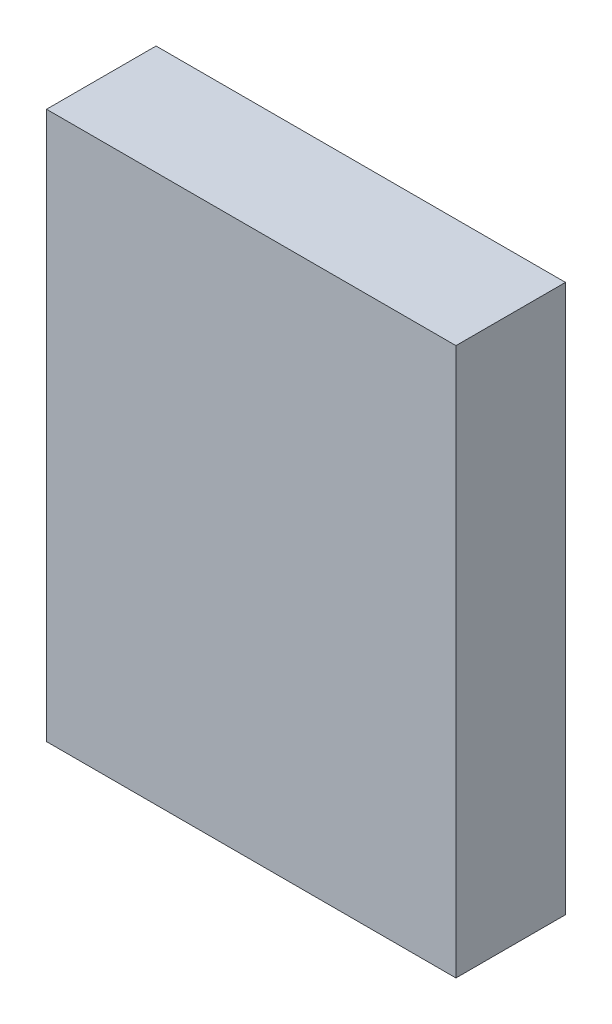
ISO-10303-21;
HEADER;
FILE_DESCRIPTION(('STEP AP214'),'2;1');
FILE_NAME('part.step','',(''),(''),'','','');
FILE_SCHEMA(('AUTOMOTIVE_DESIGN { 1 0 10303 214 1 1 1 1 }'));
ENDSEC;
DATA;
#1=APPLICATION_CONTEXT('core data for automotive mechanical design processes');
#2=APPLICATION_PROTOCOL_DEFINITION('international standard','automotive_design',2000,#1);
#3=PRODUCT_CONTEXT('',#1,'mechanical');
#4=PRODUCT('Part','Part','',(#3));
#5=PRODUCT_RELATED_PRODUCT_CATEGORY('part','',(#4));
#6=PRODUCT_DEFINITION_FORMATION('','',#4);
#7=PRODUCT_DEFINITION_CONTEXT('part definition',#1,'design');
#8=PRODUCT_DEFINITION('design','',#6,#7);
#9=PRODUCT_DEFINITION_SHAPE('','',#8);
#10=(LENGTH_UNIT() NAMED_UNIT(*) SI_UNIT(.MILLI.,.METRE.));
#11=(NAMED_UNIT(*) PLANE_ANGLE_UNIT() SI_UNIT($,.RADIAN.));
#12=(NAMED_UNIT(*) SI_UNIT($,.STERADIAN.) SOLID_ANGLE_UNIT());
#13=UNCERTAINTY_MEASURE_WITH_UNIT(LENGTH_MEASURE(1.E-05),#10,'distance_accuracy_value','');
#14=(GEOMETRIC_REPRESENTATION_CONTEXT(3) GLOBAL_UNCERTAINTY_ASSIGNED_CONTEXT((#13)) GLOBAL_UNIT_ASSIGNED_CONTEXT((#10,
#11,#12)) REPRESENTATION_CONTEXT('',''));
#15=CARTESIAN_POINT('',(0.,0.,0.));
#16=DIRECTION('',(0.,0.,1.));
#17=DIRECTION('',(1.,0.,0.));
#18=AXIS2_PLACEMENT_3D('',#15,#16,#17);
#19=CARTESIAN_POINT('',(-18.688963471708,-25.,10.));
#20=DIRECTION('',(0.,1.,0.));
#21=DIRECTION('',(0.,0.,1.));
#22=AXIS2_PLACEMENT_3D('',#19,#20,#21);
#23=PLANE('',#22);
#24=DIRECTION('',(1.,0.,0.));
#25=VECTOR('',#24,1.);
#26=CARTESIAN_POINT('',(-18.688963471708,-25.,0.));
#27=LINE('',#26,#25);
#28=CARTESIAN_POINT('',(-18.688963471708,-25.,0.));
#29=VERTEX_POINT('',#28);
#30=CARTESIAN_POINT('',(18.688963471708,-25.,0.));
#31=VERTEX_POINT('',#30);
#32=EDGE_CURVE('E111',#29,#31,#27,.T.);
#33=ORIENTED_EDGE('',*,*,#32,.T.);
#34=DIRECTION('',(0.,0.,-1.));
#35=VECTOR('',#34,1.);
#36=CARTESIAN_POINT('',(18.688963471708,-25.,10.));
#37=LINE('',#36,#35);
#38=CARTESIAN_POINT('',(18.688963471708,-25.,10.));
#39=VERTEX_POINT('',#38);
#40=EDGE_CURVE('E11',#39,#31,#37,.T.);
#41=ORIENTED_EDGE('',*,*,#40,.F.);
#42=DIRECTION('',(1.,0.,0.));
#43=VECTOR('',#42,1.);
#44=CARTESIAN_POINT('',(-18.688963471708,-25.,10.));
#45=LINE('',#44,#43);
#46=CARTESIAN_POINT('',(-18.688963471708,-25.,10.));
#47=VERTEX_POINT('',#46);
#48=EDGE_CURVE('E96',#47,#39,#45,.T.);
#49=ORIENTED_EDGE('',*,*,#48,.F.);
#50=DIRECTION('',(0.,0.,-1.));
#51=VECTOR('',#50,1.);
#52=CARTESIAN_POINT('',(-18.688963471708,-25.,10.));
#53=LINE('',#52,#51);
#54=EDGE_CURVE('E63',#47,#29,#53,.T.);
#55=ORIENTED_EDGE('',*,*,#54,.T.);
#56=EDGE_LOOP('',(#33,#41,#49,#55));
#57=FACE_BOUND('',#56,.T.);
#58=ADVANCED_FACE('F47',(#57),#23,.F.);
#59=CARTESIAN_POINT('',(18.688963471708,-25.,10.));
#60=DIRECTION('',(-1.,0.,0.));
#61=DIRECTION('',(0.,0.,1.));
#62=AXIS2_PLACEMENT_3D('',#59,#60,#61);
#63=PLANE('',#62);
#64=DIRECTION('',(0.,1.,0.));
#65=VECTOR('',#64,1.);
#66=CARTESIAN_POINT('',(18.688963471708,-25.,0.));
#67=LINE('',#66,#65);
#68=CARTESIAN_POINT('',(18.688963471708,25.,0.));
#69=VERTEX_POINT('',#68);
#70=EDGE_CURVE('E102',#31,#69,#67,.T.);
#71=ORIENTED_EDGE('',*,*,#70,.T.);
#72=DIRECTION('',(0.,0.,-1.));
#73=VECTOR('',#72,1.);
#74=CARTESIAN_POINT('',(18.688963471708,25.,10.));
#75=LINE('',#74,#73);
#76=CARTESIAN_POINT('',(18.688963471708,25.,10.));
#77=VERTEX_POINT('',#76);
#78=EDGE_CURVE('E55',#77,#69,#75,.T.);
#79=ORIENTED_EDGE('',*,*,#78,.F.);
#80=DIRECTION('',(0.,1.,0.));
#81=VECTOR('',#80,1.);
#82=CARTESIAN_POINT('',(18.688963471708,-25.,10.));
#83=LINE('',#82,#81);
#84=EDGE_CURVE('E88',#39,#77,#83,.T.);
#85=ORIENTED_EDGE('',*,*,#84,.F.);
#86=ORIENTED_EDGE('',*,*,#40,.T.);
#87=EDGE_LOOP('',(#71,#79,#85,#86));
#88=FACE_BOUND('',#87,.T.);
#89=ADVANCED_FACE('F101',(#88),#63,.F.);
#90=CARTESIAN_POINT('',(-18.688963471708,25.,10.));
#91=DIRECTION('',(0.,1.,0.));
#92=DIRECTION('',(0.,0.,1.));
#93=AXIS2_PLACEMENT_3D('',#90,#91,#92);
#94=PLANE('',#93);
#95=DIRECTION('',(1.,0.,0.));
#96=VECTOR('',#95,1.);
#97=CARTESIAN_POINT('',(-18.688963471708,25.,0.));
#98=LINE('',#97,#96);
#99=CARTESIAN_POINT('',(-18.688963471708,25.,0.));
#100=VERTEX_POINT('',#99);
#101=EDGE_CURVE('E114',#100,#69,#98,.T.);
#102=ORIENTED_EDGE('',*,*,#101,.F.);
#103=DIRECTION('',(0.,0.,-1.));
#104=VECTOR('',#103,1.);
#105=CARTESIAN_POINT('',(-18.688963471708,25.,10.));
#106=LINE('',#105,#104);
#107=CARTESIAN_POINT('',(-18.688963471708,25.,10.));
#108=VERTEX_POINT('',#107);
#109=EDGE_CURVE('E77',#108,#100,#106,.T.);
#110=ORIENTED_EDGE('',*,*,#109,.F.);
#111=DIRECTION('',(1.,0.,0.));
#112=VECTOR('',#111,1.);
#113=CARTESIAN_POINT('',(-18.688963471708,25.,10.));
#114=LINE('',#113,#112);
#115=EDGE_CURVE('E95',#108,#77,#114,.T.);
#116=ORIENTED_EDGE('',*,*,#115,.T.);
#117=ORIENTED_EDGE('',*,*,#78,.T.);
#118=EDGE_LOOP('',(#102,#110,#116,#117));
#119=FACE_BOUND('',#118,.T.);
#120=ADVANCED_FACE('F105',(#119),#94,.T.);
#121=CARTESIAN_POINT('',(-18.688963471708,-25.,10.));
#122=DIRECTION('',(-1.,0.,0.));
#123=DIRECTION('',(0.,0.,1.));
#124=AXIS2_PLACEMENT_3D('',#121,#122,#123);
#125=PLANE('',#124);
#126=DIRECTION('',(0.,1.,0.));
#127=VECTOR('',#126,1.);
#128=CARTESIAN_POINT('',(-18.688963471708,-25.,0.));
#129=LINE('',#128,#127);
#130=EDGE_CURVE('E116',#29,#100,#129,.T.);
#131=ORIENTED_EDGE('',*,*,#130,.F.);
#132=ORIENTED_EDGE('',*,*,#54,.F.);
#133=DIRECTION('',(0.,1.,0.));
#134=VECTOR('',#133,1.);
#135=CARTESIAN_POINT('',(-18.688963471708,-25.,10.));
#136=LINE('',#135,#134);
#137=EDGE_CURVE('E106',#47,#108,#136,.T.);
#138=ORIENTED_EDGE('',*,*,#137,.T.);
#139=ORIENTED_EDGE('',*,*,#109,.T.);
#140=EDGE_LOOP('',(#131,#132,#138,#139));
#141=FACE_BOUND('',#140,.T.);
#142=ADVANCED_FACE('F122',(#141),#125,.T.);
#143=CARTESIAN_POINT('',(0.,0.,10.));
#144=DIRECTION('',(0.,0.,1.));
#145=DIRECTION('',(1.,0.,0.));
#146=AXIS2_PLACEMENT_3D('',#143,#144,#145);
#147=PLANE('',#146);
#148=ORIENTED_EDGE('',*,*,#48,.T.);
#149=ORIENTED_EDGE('',*,*,#84,.T.);
#150=ORIENTED_EDGE('',*,*,#115,.F.);
#151=ORIENTED_EDGE('',*,*,#137,.F.);
#152=EDGE_LOOP('',(#148,#149,#150,#151));
#153=FACE_BOUND('',#152,.T.);
#154=ADVANCED_FACE('F92',(#153),#147,.T.);
#155=CARTESIAN_POINT('',(0.,0.,0.));
#156=DIRECTION('',(0.,0.,1.));
#157=DIRECTION('',(1.,0.,0.));
#158=AXIS2_PLACEMENT_3D('',#155,#156,#157);
#159=PLANE('',#158);
#160=ORIENTED_EDGE('',*,*,#32,.F.);
#161=ORIENTED_EDGE('',*,*,#130,.T.);
#162=ORIENTED_EDGE('',*,*,#101,.T.);
#163=ORIENTED_EDGE('',*,*,#70,.F.);
#164=EDGE_LOOP('',(#160,#161,#162,#163));
#165=FACE_BOUND('',#164,.T.);
#166=ADVANCED_FACE('F121',(#165),#159,.F.);
#167=CLOSED_SHELL('',(#58,#89,#120,#142,#154,#166));
#168=MANIFOLD_SOLID_BREP('B2',#167);
#169=ADVANCED_BREP_SHAPE_REPRESENTATION('',(#18,#168),#14);
#170=SHAPE_DEFINITION_REPRESENTATION(#9,#169);
ENDSEC;
END-ISO-10303-21;
